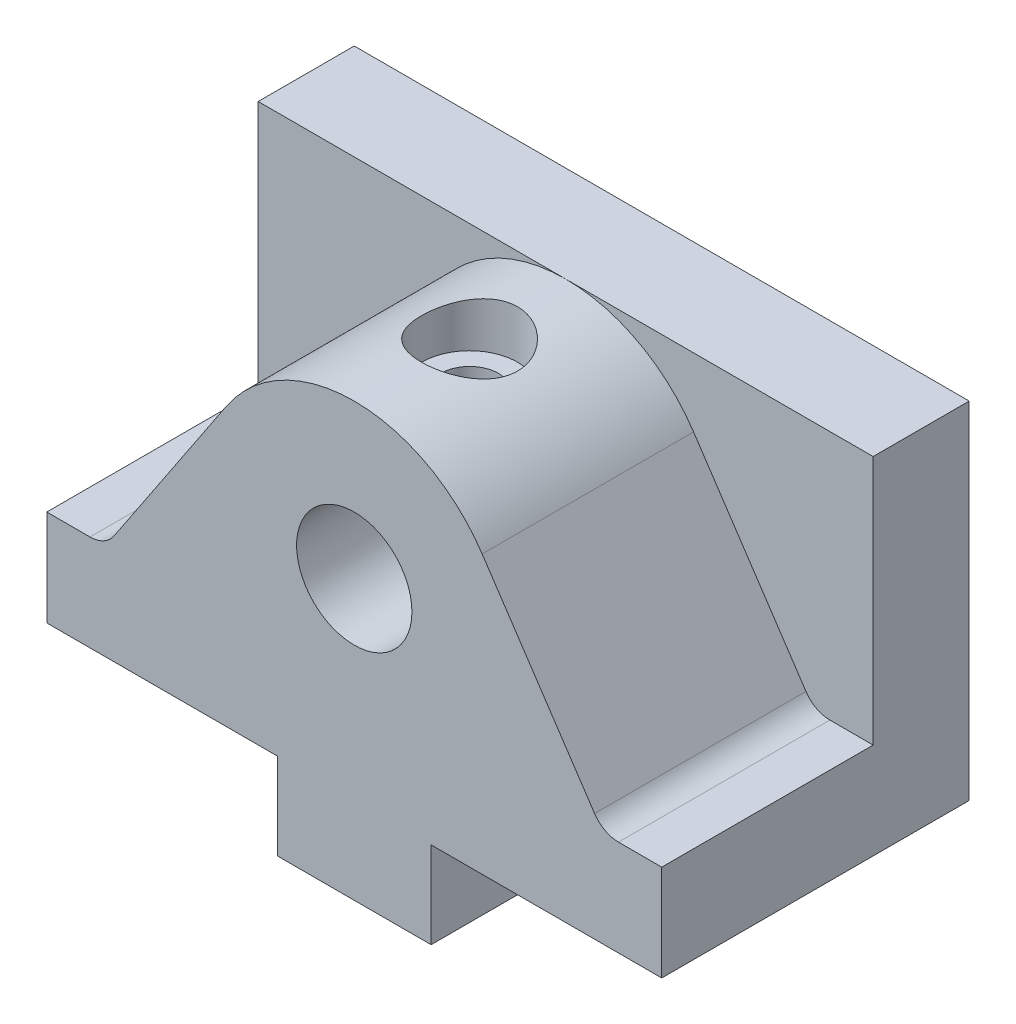
ISO-10303-21;
HEADER;
FILE_DESCRIPTION(('STEP AP214'),'2;1');
FILE_NAME('part.step','',(''),(''),'','','');
FILE_SCHEMA(('AUTOMOTIVE_DESIGN { 1 0 10303 214 1 1 1 1 }'));
ENDSEC;
DATA;
#1=APPLICATION_CONTEXT('core data for automotive mechanical design processes');
#2=APPLICATION_PROTOCOL_DEFINITION('international standard','automotive_design',2000,#1);
#3=PRODUCT_CONTEXT('',#1,'mechanical');
#4=PRODUCT('Part','Part','',(#3));
#5=PRODUCT_RELATED_PRODUCT_CATEGORY('part','',(#4));
#6=PRODUCT_DEFINITION_FORMATION('','',#4);
#7=PRODUCT_DEFINITION_CONTEXT('part definition',#1,'design');
#8=PRODUCT_DEFINITION('design','',#6,#7);
#9=PRODUCT_DEFINITION_SHAPE('','',#8);
#10=(LENGTH_UNIT() NAMED_UNIT(*) SI_UNIT(.MILLI.,.METRE.));
#11=(NAMED_UNIT(*) PLANE_ANGLE_UNIT() SI_UNIT($,.RADIAN.));
#12=(NAMED_UNIT(*) SI_UNIT($,.STERADIAN.) SOLID_ANGLE_UNIT());
#13=UNCERTAINTY_MEASURE_WITH_UNIT(LENGTH_MEASURE(1.E-05),#10,'distance_accuracy_value','');
#14=(GEOMETRIC_REPRESENTATION_CONTEXT(3) GLOBAL_UNCERTAINTY_ASSIGNED_CONTEXT((#13)) GLOBAL_UNIT_ASSIGNED_CONTEXT((#10,
#11,#12)) REPRESENTATION_CONTEXT('',''));
#15=CARTESIAN_POINT('',(0.,0.,0.));
#16=DIRECTION('',(0.,0.,1.));
#17=DIRECTION('',(1.,0.,0.));
#18=AXIS2_PLACEMENT_3D('',#15,#16,#17);
#19=CARTESIAN_POINT('',(-32.,-18.0000000000004,16.));
#20=DIRECTION('',(0.,1.,0.));
#21=DIRECTION('',(0.,0.,0.999999999999989));
#22=AXIS2_PLACEMENT_3D('',#19,#20,#21);
#23=PLANE('',#22);
#24=DIRECTION('',(0.,0.,0.999999999999989));
#25=VECTOR('',#24,1.);
#26=CARTESIAN_POINT('',(8.00000000000001,-18.0000000000004,-15.9999999999997));
#27=LINE('',#26,#25);
#28=CARTESIAN_POINT('',(8.00000000000001,-18.0000000000004,-15.9999999999997));
#29=VERTEX_POINT('',#28);
#30=CARTESIAN_POINT('',(8.00000000000001,-18.,16.));
#31=VERTEX_POINT('',#30);
#32=EDGE_CURVE('E194',#29,#31,#27,.T.);
#33=ORIENTED_EDGE('',*,*,#32,.F.);
#34=DIRECTION('',(1.,0.,0.));
#35=VECTOR('',#34,1.);
#36=CARTESIAN_POINT('',(-32.,-18.0000000000008,-15.9999999999997));
#37=LINE('',#36,#35);
#38=CARTESIAN_POINT('',(32.,-18.0000000000004,-15.9999999999997));
#39=VERTEX_POINT('',#38);
#40=EDGE_CURVE('E332',#29,#39,#37,.T.);
#41=ORIENTED_EDGE('',*,*,#40,.T.);
#42=DIRECTION('',(0.,0.,-0.999999999999989));
#43=VECTOR('',#42,1.);
#44=CARTESIAN_POINT('',(32.,-18.,16.));
#45=LINE('',#44,#43);
#46=CARTESIAN_POINT('',(32.,-18.,16.));
#47=VERTEX_POINT('',#46);
#48=EDGE_CURVE('E357',#47,#39,#45,.T.);
#49=ORIENTED_EDGE('',*,*,#48,.F.);
#50=DIRECTION('',(1.,0.,0.));
#51=VECTOR('',#50,1.);
#52=CARTESIAN_POINT('',(-32.,-18.0000000000004,16.));
#53=LINE('',#52,#51);
#54=EDGE_CURVE('E387',#31,#47,#53,.T.);
#55=ORIENTED_EDGE('',*,*,#54,.F.);
#56=EDGE_LOOP('',(#33,#41,#49,#55));
#57=FACE_BOUND('',#56,.T.);
#58=ADVANCED_FACE('F41',(#57),#23,.F.);
#59=CARTESIAN_POINT('',(-32.,17.9999999999996,15.9999999999998));
#60=DIRECTION('',(1.,0.,0.));
#61=DIRECTION('',(0.,1.,0.));
#62=AXIS2_PLACEMENT_3D('',#59,#60,#61);
#63=PLANE('',#62);
#64=DIRECTION('',(0.,-1.,0.));
#65=VECTOR('',#64,1.);
#66=CARTESIAN_POINT('',(-32.,17.9999999999996,15.9999999999998));
#67=LINE('',#66,#65);
#68=CARTESIAN_POINT('',(-32.,-8.00000000000045,15.9999999999997));
#69=VERTEX_POINT('',#68);
#70=CARTESIAN_POINT('',(-32.,-18.0000000000004,16.));
#71=VERTEX_POINT('',#70);
#72=EDGE_CURVE('E351',#69,#71,#67,.T.);
#73=ORIENTED_EDGE('',*,*,#72,.F.);
#74=DIRECTION('',(0.,0.,-0.999999999999989));
#75=VECTOR('',#74,1.);
#76=CARTESIAN_POINT('',(-32.,-8.00000000000045,15.9999999999997));
#77=LINE('',#76,#75);
#78=CARTESIAN_POINT('',(-32.,-8.00000000000042,-6.));
#79=VERTEX_POINT('',#78);
#80=EDGE_CURVE('E379',#69,#79,#77,.T.);
#81=ORIENTED_EDGE('',*,*,#80,.T.);
#82=DIRECTION('',(0.,1.,0.));
#83=VECTOR('',#82,1.);
#84=CARTESIAN_POINT('',(-32.,17.9999999999996,-5.99999999999988));
#85=LINE('',#84,#83);
#86=CARTESIAN_POINT('',(-32.,17.9999999999996,-5.99999999999988));
#87=VERTEX_POINT('',#86);
#88=EDGE_CURVE('E372',#79,#87,#85,.T.);
#89=ORIENTED_EDGE('',*,*,#88,.T.);
#90=DIRECTION('',(0.,0.,-0.999999999999989));
#91=VECTOR('',#90,1.);
#92=CARTESIAN_POINT('',(-32.,17.9999999999996,15.9999999999998));
#93=LINE('',#92,#91);
#94=CARTESIAN_POINT('',(-32.,17.9999999999992,-15.9999999999997));
#95=VERTEX_POINT('',#94);
#96=EDGE_CURVE('E352',#87,#95,#93,.T.);
#97=ORIENTED_EDGE('',*,*,#96,.T.);
#98=DIRECTION('',(0.,-1.,0.));
#99=VECTOR('',#98,1.);
#100=CARTESIAN_POINT('',(-32.,17.9999999999992,-15.9999999999997));
#101=LINE('',#100,#99);
#102=CARTESIAN_POINT('',(-32.,-18.0000000000008,-15.9999999999997));
#103=VERTEX_POINT('',#102);
#104=EDGE_CURVE('E337',#95,#103,#101,.T.);
#105=ORIENTED_EDGE('',*,*,#104,.T.);
#106=DIRECTION('',(0.,0.,-0.999999999999989));
#107=VECTOR('',#106,1.);
#108=CARTESIAN_POINT('',(-32.,-18.0000000000004,16.));
#109=LINE('',#108,#107);
#110=EDGE_CURVE('E326',#71,#103,#109,.T.);
#111=ORIENTED_EDGE('',*,*,#110,.F.);
#112=EDGE_LOOP('',(#73,#81,#89,#97,#105,#111));
#113=FACE_BOUND('',#112,.T.);
#114=ADVANCED_FACE('F43',(#113),#63,.F.);
#115=CARTESIAN_POINT('',(-7.99999999999999,-18.0000000000004,-15.9999999999997));
#116=VERTEX_POINT('',#115);
#117=EDGE_CURVE('E322',#103,#116,#37,.T.);
#118=ORIENTED_EDGE('',*,*,#117,.T.);
#119=DIRECTION('',(0.,0.,0.999999999999989));
#120=VECTOR('',#119,1.);
#121=CARTESIAN_POINT('',(-7.99999999999999,-18.0000000000004,-15.9999999999997));
#122=LINE('',#121,#120);
#123=CARTESIAN_POINT('',(-7.99999999999999,-18.,16.));
#124=VERTEX_POINT('',#123);
#125=EDGE_CURVE('E205',#116,#124,#122,.T.);
#126=ORIENTED_EDGE('',*,*,#125,.T.);
#127=EDGE_CURVE('E391',#71,#124,#53,.T.);
#128=ORIENTED_EDGE('',*,*,#127,.F.);
#129=ORIENTED_EDGE('',*,*,#110,.T.);
#130=EDGE_LOOP('',(#118,#126,#128,#129));
#131=FACE_BOUND('',#130,.T.);
#132=ADVANCED_FACE('F305',(#131),#23,.F.);
#133=CARTESIAN_POINT('',(32.,18.,15.9999999999998));
#134=DIRECTION('',(-1.,0.,0.));
#135=DIRECTION('',(0.,-1.,0.));
#136=AXIS2_PLACEMENT_3D('',#133,#134,#135);
#137=PLANE('',#136);
#138=DIRECTION('',(0.,-1.,0.));
#139=VECTOR('',#138,1.);
#140=CARTESIAN_POINT('',(32.,18.,-5.99999999999988));
#141=LINE('',#140,#139);
#142=CARTESIAN_POINT('',(32.,18.,-5.99999999999988));
#143=VERTEX_POINT('',#142);
#144=CARTESIAN_POINT('',(32.,-8.00750575677747,-6.));
#145=VERTEX_POINT('',#144);
#146=EDGE_CURVE('E380',#143,#145,#141,.T.);
#147=ORIENTED_EDGE('',*,*,#146,.T.);
#148=DIRECTION('',(0.,0.,0.999999999999989));
#149=VECTOR('',#148,1.);
#150=CARTESIAN_POINT('',(32.,-8.00750575677747,-6.));
#151=LINE('',#150,#149);
#152=CARTESIAN_POINT('',(32.,-8.00750575677747,15.9999999999997));
#153=VERTEX_POINT('',#152);
#154=EDGE_CURVE('E403',#145,#153,#151,.T.);
#155=ORIENTED_EDGE('',*,*,#154,.T.);
#156=DIRECTION('',(0.,1.,0.));
#157=VECTOR('',#156,1.);
#158=CARTESIAN_POINT('',(32.,18.,15.9999999999998));
#159=LINE('',#158,#157);
#160=EDGE_CURVE('E355',#47,#153,#159,.T.);
#161=ORIENTED_EDGE('',*,*,#160,.F.);
#162=ORIENTED_EDGE('',*,*,#48,.T.);
#163=DIRECTION('',(0.,1.,0.));
#164=VECTOR('',#163,1.);
#165=CARTESIAN_POINT('',(32.,17.9999999999996,-15.9999999999997));
#166=LINE('',#165,#164);
#167=CARTESIAN_POINT('',(32.,17.9999999999996,-15.9999999999997));
#168=VERTEX_POINT('',#167);
#169=EDGE_CURVE('E331',#39,#168,#166,.T.);
#170=ORIENTED_EDGE('',*,*,#169,.T.);
#171=DIRECTION('',(0.,0.,-0.999999999999989));
#172=VECTOR('',#171,1.);
#173=CARTESIAN_POINT('',(32.,18.,15.9999999999998));
#174=LINE('',#173,#172);
#175=EDGE_CURVE('E354',#143,#168,#174,.T.);
#176=ORIENTED_EDGE('',*,*,#175,.F.);
#177=EDGE_LOOP('',(#147,#155,#161,#162,#170,#176));
#178=FACE_BOUND('',#177,.T.);
#179=ADVANCED_FACE('F313',(#178),#137,.F.);
#180=CARTESIAN_POINT('',(-32.,17.9999999999996,15.9999999999998));
#181=DIRECTION('',(0.,-1.,0.));
#182=DIRECTION('',(1.,0.,0.));
#183=AXIS2_PLACEMENT_3D('',#180,#181,#182);
#184=PLANE('',#183);
#185=ORIENTED_EDGE('',*,*,#96,.F.);
#186=DIRECTION('',(1.,0.,0.));
#187=VECTOR('',#186,1.);
#188=CARTESIAN_POINT('',(-32.,17.9999999999996,-5.99999999999988));
#189=LINE('',#188,#187);
#190=CARTESIAN_POINT('',(0.,18.,-5.99999999999988));
#191=VERTEX_POINT('',#190);
#192=EDGE_CURVE('E55',#87,#191,#189,.T.);
#193=ORIENTED_EDGE('',*,*,#192,.T.);
#194=EDGE_CURVE('E341',#191,#143,#189,.T.);
#195=ORIENTED_EDGE('',*,*,#194,.T.);
#196=ORIENTED_EDGE('',*,*,#175,.T.);
#197=DIRECTION('',(-1.,0.,0.));
#198=VECTOR('',#197,1.);
#199=CARTESIAN_POINT('',(-32.,17.9999999999992,-15.9999999999997));
#200=LINE('',#199,#198);
#201=EDGE_CURVE('E335',#168,#95,#200,.T.);
#202=ORIENTED_EDGE('',*,*,#201,.T.);
#203=EDGE_LOOP('',(#185,#193,#195,#196,#202));
#204=FACE_BOUND('',#203,.T.);
#205=ADVANCED_FACE('F318',(#204),#184,.F.);
#206=CARTESIAN_POINT('',(0.,0.,16.));
#207=DIRECTION('',(0.,0.,0.999999999999989));
#208=DIRECTION('',(1.,0.,0.));
#209=AXIS2_PLACEMENT_3D('',#206,#207,#208);
#210=PLANE('',#209);
#211=CARTESIAN_POINT('',(0.,2.,16.));
#212=DIRECTION('',(0.,0.,0.999999999999989));
#213=DIRECTION('',(1.,0.,0.));
#214=AXIS2_PLACEMENT_3D('',#211,#212,#213);
#215=CIRCLE('',#214,6.);
#216=CARTESIAN_POINT('',(6.,2.,16.));
#217=VERTEX_POINT('',#216);
#218=EDGE_CURVE('E202',#217,#217,#215,.T.);
#219=ORIENTED_EDGE('',*,*,#218,.F.);
#220=EDGE_LOOP('',(#219));
#221=FACE_BOUND('',#220,.T.);
#222=DIRECTION('',(1.,0.,0.));
#223=VECTOR('',#222,1.);
#224=CARTESIAN_POINT('',(0.,-8.00000000000001,15.9999999999997));
#225=LINE('',#224,#223);
#226=CARTESIAN_POINT('',(-27.4999965616356,-8.00000000000045,15.9999999999997));
#227=VERTEX_POINT('',#226);
#228=EDGE_CURVE('E362',#69,#227,#225,.T.);
#229=ORIENTED_EDGE('',*,*,#228,.F.);
#230=ORIENTED_EDGE('',*,*,#72,.T.);
#231=ORIENTED_EDGE('',*,*,#127,.T.);
#232=DIRECTION('',(0.,-1.,0.));
#233=VECTOR('',#232,1.);
#234=CARTESIAN_POINT('',(-7.99999999999999,-18.,16.));
#235=LINE('',#234,#233);
#236=CARTESIAN_POINT('',(-7.99999999999976,-27.0000000000002,16.));
#237=VERTEX_POINT('',#236);
#238=EDGE_CURVE('E62',#124,#237,#235,.T.);
#239=ORIENTED_EDGE('',*,*,#238,.T.);
#240=DIRECTION('',(1.,0.,0.));
#241=VECTOR('',#240,1.);
#242=CARTESIAN_POINT('',(-7.99999999999976,-27.0000000000002,16.));
#243=LINE('',#242,#241);
#244=CARTESIAN_POINT('',(8.00000000000024,-27.0000000000002,16.));
#245=VERTEX_POINT('',#244);
#246=EDGE_CURVE('E196',#237,#245,#243,.T.);
#247=ORIENTED_EDGE('',*,*,#246,.T.);
#248=DIRECTION('',(0.,1.,0.));
#249=VECTOR('',#248,1.);
#250=CARTESIAN_POINT('',(8.00000000000001,-18.,16.));
#251=LINE('',#250,#249);
#252=EDGE_CURVE('E190',#245,#31,#251,.T.);
#253=ORIENTED_EDGE('',*,*,#252,.T.);
#254=ORIENTED_EDGE('',*,*,#54,.T.);
#255=ORIENTED_EDGE('',*,*,#160,.T.);
#256=DIRECTION('',(0.999999243771718,-0.00122981949535773,0.));
#257=VECTOR('',#256,1.);
#258=CARTESIAN_POINT('',(27.5000034030273,-8.00197156904836,15.9999999999997));
#259=LINE('',#258,#257);
#260=CARTESIAN_POINT('',(27.5000034030273,-8.00197156904836,15.9999999999997));
#261=VERTEX_POINT('',#260);
#262=EDGE_CURVE('E441',#261,#153,#259,.T.);
#263=ORIENTED_EDGE('',*,*,#262,.F.);
#264=CARTESIAN_POINT('',(27.5036928615133,-5.00197383773321,16.));
#265=DIRECTION('',(0.,0.,0.999999999999989));
#266=DIRECTION('',(-1.,0.,0.));
#267=AXIS2_PLACEMENT_3D('',#264,#265,#266);
#268=CIRCLE('',#267,3.);
#269=CARTESIAN_POINT('',(25.0075782470475,-6.66612882794598,16.));
#270=VERTEX_POINT('',#269);
#271=EDGE_CURVE('E439',#270,#261,#268,.T.);
#272=ORIENTED_EDGE('',*,*,#271,.F.);
#273=DIRECTION('',(0.554718330070926,-0.832038204821944,0.));
#274=VECTOR('',#273,1.);
#275=CARTESIAN_POINT('',(13.3126112771511,10.8754932811348,16.));
#276=LINE('',#275,#274);
#277=CARTESIAN_POINT('',(13.3126112771511,10.8754932811348,16.));
#278=VERTEX_POINT('',#277);
#279=EDGE_CURVE('E437',#278,#270,#276,.T.);
#280=ORIENTED_EDGE('',*,*,#279,.F.);
#281=CARTESIAN_POINT('',(0.,2.,16.));
#282=DIRECTION('',(0.,0.,0.999999999999989));
#283=DIRECTION('',(1.,0.,0.));
#284=AXIS2_PLACEMENT_3D('',#281,#282,#283);
#285=CIRCLE('',#284,16.);
#286=CARTESIAN_POINT('',(-13.3134451757018,10.8742423650458,16.));
#287=VERTEX_POINT('',#286);
#288=EDGE_CURVE('E361',#287,#278,#285,.F.);
#289=ORIENTED_EDGE('',*,*,#288,.F.);
#290=DIRECTION('',(0.554640147815392,0.832090323481364,0.));
#291=VECTOR('',#290,1.);
#292=CARTESIAN_POINT('',(-25.0037255911915,-6.66392044344663,16.));
#293=LINE('',#292,#291);
#294=CARTESIAN_POINT('',(-25.0037255911915,-6.66392044344663,16.));
#295=VERTEX_POINT('',#294);
#296=EDGE_CURVE('E434',#295,#287,#293,.T.);
#297=ORIENTED_EDGE('',*,*,#296,.F.);
#298=CARTESIAN_POINT('',(-27.4999965616356,-5.00000000000045,16.));
#299=DIRECTION('',(0.,0.,0.999999999999989));
#300=DIRECTION('',(-1.,0.,0.));
#301=AXIS2_PLACEMENT_3D('',#298,#299,#300);
#302=CIRCLE('',#301,3.);
#303=EDGE_CURVE('E70',#227,#295,#302,.T.);
#304=ORIENTED_EDGE('',*,*,#303,.F.);
#305=EDGE_LOOP('',(#229,#230,#231,#239,#247,#253,#254,#255,#263,#272,#280,#289,#297,#304));
#306=FACE_BOUND('',#305,.T.);
#307=ADVANCED_FACE('F396',(#221,#306),#210,.T.);
#308=CARTESIAN_POINT('',(0.,-4.16333634234434E-13,-15.9999999999997));
#309=DIRECTION('',(0.,0.,0.999999999999989));
#310=DIRECTION('',(1.,0.,0.));
#311=AXIS2_PLACEMENT_3D('',#308,#309,#310);
#312=PLANE('',#311);
#313=ORIENTED_EDGE('',*,*,#104,.F.);
#314=ORIENTED_EDGE('',*,*,#201,.F.);
#315=ORIENTED_EDGE('',*,*,#169,.F.);
#316=ORIENTED_EDGE('',*,*,#40,.F.);
#317=DIRECTION('',(0.,1.,0.));
#318=VECTOR('',#317,1.);
#319=CARTESIAN_POINT('',(8.00000000000001,-18.0000000000004,-15.9999999999997));
#320=LINE('',#319,#318);
#321=CARTESIAN_POINT('',(8.00000000000024,-27.0000000000004,-15.9999999999997));
#322=VERTEX_POINT('',#321);
#323=EDGE_CURVE('E199',#322,#29,#320,.T.);
#324=ORIENTED_EDGE('',*,*,#323,.F.);
#325=DIRECTION('',(1.,0.,0.));
#326=VECTOR('',#325,1.);
#327=CARTESIAN_POINT('',(-7.99999999999976,-27.0000000000004,-15.9999999999997));
#328=LINE('',#327,#326);
#329=CARTESIAN_POINT('',(-7.99999999999976,-27.0000000000004,-15.9999999999997));
#330=VERTEX_POINT('',#329);
#331=EDGE_CURVE('E191',#330,#322,#328,.T.);
#332=ORIENTED_EDGE('',*,*,#331,.F.);
#333=DIRECTION('',(0.,-1.,0.));
#334=VECTOR('',#333,1.);
#335=CARTESIAN_POINT('',(-7.99999999999999,-18.0000000000004,-15.9999999999997));
#336=LINE('',#335,#334);
#337=EDGE_CURVE('E195',#116,#330,#336,.T.);
#338=ORIENTED_EDGE('',*,*,#337,.F.);
#339=ORIENTED_EDGE('',*,*,#117,.F.);
#340=EDGE_LOOP('',(#313,#314,#315,#316,#324,#332,#338,#339));
#341=FACE_BOUND('',#340,.T.);
#342=ADVANCED_FACE('F281',(#341),#312,.F.);
#343=CARTESIAN_POINT('',(-27.4999965616356,-5.00000000000042,-6.));
#344=DIRECTION('',(0.,0.,-0.999999999999989));
#345=DIRECTION('',(-1.,0.,0.));
#346=AXIS2_PLACEMENT_3D('',#343,#344,#345);
#347=PLANE('',#346);
#348=DIRECTION('',(1.,0.,0.));
#349=VECTOR('',#348,1.);
#350=CARTESIAN_POINT('',(-32.,-8.00000000000042,-6.));
#351=LINE('',#350,#349);
#352=CARTESIAN_POINT('',(-27.4999965616356,-8.00000000000042,-6.));
#353=VERTEX_POINT('',#352);
#354=EDGE_CURVE('E422',#79,#353,#351,.T.);
#355=ORIENTED_EDGE('',*,*,#354,.T.);
#356=CARTESIAN_POINT('',(-27.4999965616356,-5.00000000000042,-6.));
#357=DIRECTION('',(0.,0.,0.999999999999989));
#358=DIRECTION('',(-1.,0.,0.));
#359=AXIS2_PLACEMENT_3D('',#356,#357,#358);
#360=CIRCLE('',#359,3.);
#361=CARTESIAN_POINT('',(-25.0037255911915,-6.6639204434466,-6.));
#362=VERTEX_POINT('',#361);
#363=EDGE_CURVE('E442',#353,#362,#360,.T.);
#364=ORIENTED_EDGE('',*,*,#363,.T.);
#365=DIRECTION('',(0.554640147815392,0.832090323481364,0.));
#366=VECTOR('',#365,1.);
#367=CARTESIAN_POINT('',(-25.0037255911915,-6.6639204434466,-6.));
#368=LINE('',#367,#366);
#369=CARTESIAN_POINT('',(-13.3134451757018,10.8742423650459,-6.));
#370=VERTEX_POINT('',#369);
#371=EDGE_CURVE('E443',#362,#370,#368,.T.);
#372=ORIENTED_EDGE('',*,*,#371,.T.);
#373=CARTESIAN_POINT('',(0.,2.,-6.));
#374=DIRECTION('',(0.,0.,-0.999999999999989));
#375=DIRECTION('',(1.,0.,0.));
#376=AXIS2_PLACEMENT_3D('',#373,#374,#375);
#377=CIRCLE('',#376,16.);
#378=EDGE_CURVE('E376',#370,#191,#377,.T.);
#379=ORIENTED_EDGE('',*,*,#378,.T.);
#380=ORIENTED_EDGE('',*,*,#192,.F.);
#381=ORIENTED_EDGE('',*,*,#88,.F.);
#382=EDGE_LOOP('',(#355,#364,#372,#379,#380,#381));
#383=FACE_BOUND('',#382,.T.);
#384=ADVANCED_FACE('F277',(#383),#347,.F.);
#385=ORIENTED_EDGE('',*,*,#194,.F.);
#386=CARTESIAN_POINT('',(13.3126112771511,10.8754932811348,-6.));
#387=VERTEX_POINT('',#386);
#388=EDGE_CURVE('E446',#191,#387,#377,.T.);
#389=ORIENTED_EDGE('',*,*,#388,.T.);
#390=DIRECTION('',(0.554718330070926,-0.832038204821944,0.));
#391=VECTOR('',#390,1.);
#392=CARTESIAN_POINT('',(13.3126112771511,10.8754932811348,-6.));
#393=LINE('',#392,#391);
#394=CARTESIAN_POINT('',(25.0075782470475,-6.66612882794598,-6.));
#395=VERTEX_POINT('',#394);
#396=EDGE_CURVE('E451',#387,#395,#393,.T.);
#397=ORIENTED_EDGE('',*,*,#396,.T.);
#398=CARTESIAN_POINT('',(27.5036928615133,-5.00197383773321,-6.));
#399=DIRECTION('',(0.,0.,0.999999999999989));
#400=DIRECTION('',(-1.,0.,0.));
#401=AXIS2_PLACEMENT_3D('',#398,#399,#400);
#402=CIRCLE('',#401,3.);
#403=CARTESIAN_POINT('',(27.5000034030273,-8.00197156904836,-6.));
#404=VERTEX_POINT('',#403);
#405=EDGE_CURVE('E429',#395,#404,#402,.T.);
#406=ORIENTED_EDGE('',*,*,#405,.T.);
#407=DIRECTION('',(0.999999243771718,-0.00122981949535773,0.));
#408=VECTOR('',#407,1.);
#409=CARTESIAN_POINT('',(27.5000034030273,-8.00197156904836,-6.));
#410=LINE('',#409,#408);
#411=EDGE_CURVE('E426',#404,#145,#410,.T.);
#412=ORIENTED_EDGE('',*,*,#411,.T.);
#413=ORIENTED_EDGE('',*,*,#146,.F.);
#414=EDGE_LOOP('',(#385,#389,#397,#406,#412,#413));
#415=FACE_BOUND('',#414,.T.);
#416=ADVANCED_FACE('F280',(#415),#347,.F.);
#417=CARTESIAN_POINT('',(-32.,-8.00000000000042,-6.));
#418=DIRECTION('',(0.,-1.,0.));
#419=DIRECTION('',(0.,0.,-0.999999999999989));
#420=AXIS2_PLACEMENT_3D('',#417,#418,#419);
#421=PLANE('',#420);
#422=ORIENTED_EDGE('',*,*,#228,.T.);
#423=DIRECTION('',(0.,0.,0.999999999999989));
#424=VECTOR('',#423,1.);
#425=CARTESIAN_POINT('',(-27.4999965616356,-8.00000000000042,-6.));
#426=LINE('',#425,#424);
#427=EDGE_CURVE('E406',#353,#227,#426,.T.);
#428=ORIENTED_EDGE('',*,*,#427,.F.);
#429=ORIENTED_EDGE('',*,*,#354,.F.);
#430=ORIENTED_EDGE('',*,*,#80,.F.);
#431=EDGE_LOOP('',(#422,#428,#429,#430));
#432=FACE_BOUND('',#431,.T.);
#433=ADVANCED_FACE('F283',(#432),#421,.F.);
#434=CARTESIAN_POINT('',(0.,2.,-6.));
#435=DIRECTION('',(0.,0.,0.999999999999989));
#436=DIRECTION('',(1.,0.,0.));
#437=AXIS2_PLACEMENT_3D('',#434,#435,#436);
#438=CYLINDRICAL_SURFACE('',#437,16.);
#439=CARTESIAN_POINT('',(0.,18.,8.99999999999978));
#440=CARTESIAN_POINT('',(-0.273756740698203,17.9999986351195,8.99999821364948));
#441=CARTESIAN_POINT('',(-0.547532210011458,17.9929077993933,8.97744309222222));
#442=CARTESIAN_POINT('',(-1.08707683835385,17.9653157635526,8.88805503384302));
#443=CARTESIAN_POINT('',(-1.35284417090371,17.9448115279957,8.82121207454223));
#444=CARTESIAN_POINT('',(-1.86851417460314,17.892632627915,8.64572251521696));
#445=CARTESIAN_POINT('',(-2.11844070794293,17.860975259956,8.5371406213886));
#446=CARTESIAN_POINT('',(-2.5965392093863,17.7897587664487,8.28153072928613));
#447=CARTESIAN_POINT('',(-2.82470774178095,17.7501983960149,8.13449667287551));
#448=CARTESIAN_POINT('',(-3.25986133980766,17.6660085495921,7.80137603193234));
#449=CARTESIAN_POINT('',(-3.46608011262123,17.621268637007,7.6143164597632));
#450=CARTESIAN_POINT('',(-3.84478952815349,17.5324018550409,7.20852643033821));
#451=CARTESIAN_POINT('',(-4.01727389161517,17.4882751012093,6.98979008999342));
#452=CARTESIAN_POINT('',(-4.32777345930636,17.4044457876485,6.52022174479267));
#453=CARTESIAN_POINT('',(-4.46483136593109,17.3648795310221,6.2687300899923));
#454=CARTESIAN_POINT('',(-4.69438964299238,17.2963120709366,5.74483074017738));
#455=CARTESIAN_POINT('',(-4.78690175085852,17.2673080849026,5.47242857685659));
#456=CARTESIAN_POINT('',(-4.92193839721855,17.224304279618,4.92308769016631));
#457=CARTESIAN_POINT('',(-4.96588440031618,17.2098789171452,4.64653262543181));
#458=CARTESIAN_POINT('',(-5.00698220147793,17.1964022056731,4.08962752436521));
#459=CARTESIAN_POINT('',(-5.00414643984171,17.1973467694717,3.80927851673902));
#460=CARTESIAN_POINT('',(-4.95287298929816,17.2141275626545,3.26450215888892));
#461=CARTESIAN_POINT('',(-4.90624231472934,17.229373668447,2.99988349644806));
#462=CARTESIAN_POINT('',(-4.7716325341796,17.272081024701,2.48243137375098));
#463=CARTESIAN_POINT('',(-4.68364903377186,17.2995435733467,2.22959916914171));
#464=CARTESIAN_POINT('',(-4.46755498726522,17.3640417609541,1.73859222230163));
#465=CARTESIAN_POINT('',(-4.33887702648709,17.4012113865356,1.50068555724072));
#466=CARTESIAN_POINT('',(-4.04544082951014,17.4808742631002,1.04924892847494));
#467=CARTESIAN_POINT('',(-3.88067322086204,17.523368895754,0.835725318982906));
#468=CARTESIAN_POINT('',(-3.51086781672958,17.6112611120491,0.42890022633462));
#469=CARTESIAN_POINT('',(-3.3043382823716,17.6567027842357,0.236961768881972));
#470=CARTESIAN_POINT('',(-2.86145763238188,17.7436628303753,-0.109887574319321));
#471=CARTESIAN_POINT('',(-2.62510430939601,17.7851809135328,-0.264795716876882));
#472=CARTESIAN_POINT('',(-2.12665844186189,17.8600517956098,-0.53411075440481));
#473=CARTESIAN_POINT('',(-1.86437962767716,17.8933384259289,-0.648192541855809));
#474=CARTESIAN_POINT('',(-1.32307191113059,17.9475182331416,-0.830212003406286));
#475=CARTESIAN_POINT('',(-1.04404812289844,17.968415173006,-0.898163688953468));
#476=CARTESIAN_POINT('',(-0.488740629161378,17.9948555758007,-0.983672170315793));
#477=CARTESIAN_POINT('',(-0.212767395155369,18.0009609158175,-1.00307417437408));
#478=CARTESIAN_POINT('',(0.338521222930339,17.9987919892393,-0.996135093450667));
#479=CARTESIAN_POINT('',(0.613836697226024,17.9905198232454,-0.969800690709442));
#480=CARTESIAN_POINT('',(1.1488773319034,17.9608945507905,-0.873617629574333));
#481=CARTESIAN_POINT('',(1.40881991368378,17.9398717244275,-0.804866929550025));
#482=CARTESIAN_POINT('',(1.91340771544553,17.8872048551716,-0.627142590533112));
#483=CARTESIAN_POINT('',(2.15805104179622,17.8555595005738,-0.518163983899842));
#484=CARTESIAN_POINT('',(2.63172962668875,17.783941710377,-0.260107133805127));
#485=CARTESIAN_POINT('',(2.86023895915121,17.7437850727067,-0.110116050012705));
#486=CARTESIAN_POINT('',(3.28946340384108,17.6597364001372,0.224612840469742));
#487=CARTESIAN_POINT('',(3.4901709521758,17.6158433539155,0.409360070978669));
#488=CARTESIAN_POINT('',(3.86634985167605,17.5270797953257,0.817035560208513));
#489=CARTESIAN_POINT('',(4.04050609358126,17.4822394682577,1.04118665495696));
#490=CARTESIAN_POINT('',(4.34885000980608,17.3984778838242,1.51650646550711));
#491=CARTESIAN_POINT('',(4.48303831893719,17.3595565324524,1.76767475210795));
#492=CARTESIAN_POINT('',(4.70680333922168,17.2924712932348,2.28938069148192));
#493=CARTESIAN_POINT('',(4.79655278224049,17.264265854275,2.55983859774289));
#494=CARTESIAN_POINT('',(4.9289157727236,17.2220468337724,3.11308997299448));
#495=CARTESIAN_POINT('',(4.97154725655977,17.2080278520491,3.39587870537413));
#496=CARTESIAN_POINT('',(5.00717624632502,17.1963317085551,3.95201635032171));
#497=CARTESIAN_POINT('',(5.00233118486542,17.1979441840057,4.22521381538967));
#498=CARTESIAN_POINT('',(4.94835272515335,17.2156036150362,4.76669833976775));
#499=CARTESIAN_POINT('',(4.89922139290049,17.2316498972642,5.03498562754694));
#500=CARTESIAN_POINT('',(4.7595091965447,17.2758725673356,5.55517615836757));
#501=CARTESIAN_POINT('',(4.66954569624033,17.3038679276103,5.80726176437345));
#502=CARTESIAN_POINT('',(4.45120909339998,17.3687881701826,6.29296165413602));
#503=CARTESIAN_POINT('',(4.32282817776947,17.4057148685869,6.52657216831362));
#504=CARTESIAN_POINT('',(4.02542700053976,17.4861394813401,6.97858388175925));
#505=CARTESIAN_POINT('',(3.85501334096536,17.5298379569183,7.19603251800096));
#506=CARTESIAN_POINT('',(3.48083598561924,17.6179599528484,7.59994531244788));
#507=CARTESIAN_POINT('',(3.27706336937754,17.6623836642662,7.786401155964));
#508=CARTESIAN_POINT('',(2.83394665129338,17.748690878099,8.12913015345153));
#509=CARTESIAN_POINT('',(2.59365829794962,17.7904440692269,8.28421894579978));
#510=CARTESIAN_POINT('',(2.08911655205469,17.8650707718751,8.55159566055776));
#511=CARTESIAN_POINT('',(1.82487263118181,17.8979477726329,8.6639004085671));
#512=CARTESIAN_POINT('',(1.3029905414959,17.9488260293388,8.83436547043366));
#513=CARTESIAN_POINT('',(1.04668134845021,17.9678496322456,8.89629946922136));
#514=CARTESIAN_POINT('',(0.526919581761033,17.9934360136194,8.97911343987086));
#515=CARTESIAN_POINT('',(0.263468464558714,18.0000013135858,9.00000171921579));
#516=CARTESIAN_POINT('',(0.,18.,8.99999999999978));
#517=B_SPLINE_CURVE_WITH_KNOTS('',3,(#439,#440,#441,#442,#443,#444,#445,#446,#447,#448,#449,
#450,#451,#452,#453,#454,#455,#456,#457,#458,#459,#460,#461,#462,#463,#464,#465,#466,#467,#468,
#469,#470,#471,#472,#473,#474,#475,#476,#477,#478,#479,#480,#481,#482,#483,#484,#485,#486,#487,
#488,#489,#490,#491,#492,#493,#494,#495,#496,#497,#498,#499,#500,#501,#502,#503,#504,#505,#506,
#507,#508,#509,#510,#511,#512,#513,#514,#515,#516),.UNSPECIFIED.,.T.,.F.,(4,2,2,2,2,2,2,2,2,2,2,
2,2,2,2,2,2,2,2,2,2,2,2,2,2,2,2,2,2,2,2,2,2,2,2,2,2,2,4),(0.,0.82030179773006,1.6407892933963,
2.46000991680979,3.27935968623363,4.12151288780633,4.96382269725097,5.82695084991444,
6.68985145121455,7.52676600672187,8.363458011839,9.16707669695186,9.97078079925592,
10.7862257089152,11.6018826405077,12.4546698912773,13.3075202966255,14.1670184276841,
15.0262553798755,15.8523027420228,16.6782294260679,17.4836250690082,18.2891202014734,
19.1142529896271,19.9396098284638,20.7976711486189,21.6557188394418,22.5104046302275,
23.3647649559869,24.1804881394264,24.9961732705186,25.7999165363421,26.6038233736822,
27.4391805607296,28.2747614954087,29.1376267255316,30.0001522671286,30.7897854665367,
31.579258830997),.UNSPECIFIED.);
#518=CARTESIAN_POINT('',(0.,18.,8.99999999999978));
#519=VERTEX_POINT('',#518);
#520=EDGE_CURVE('E11',#519,#519,#517,.T.);
#521=ORIENTED_EDGE('',*,*,#520,.T.);
#522=EDGE_LOOP('',(#521));
#523=FACE_BOUND('',#522,.T.);
#524=ORIENTED_EDGE('',*,*,#288,.T.);
#525=DIRECTION('',(0.,0.,0.999999999999989));
#526=VECTOR('',#525,1.);
#527=CARTESIAN_POINT('',(13.3126112771511,10.8754932811348,-6.));
#528=LINE('',#527,#526);
#529=EDGE_CURVE('E415',#387,#278,#528,.T.);
#530=ORIENTED_EDGE('',*,*,#529,.F.);
#531=ORIENTED_EDGE('',*,*,#388,.F.);
#532=ORIENTED_EDGE('',*,*,#378,.F.);
#533=DIRECTION('',(0.,0.,0.999999999999989));
#534=VECTOR('',#533,1.);
#535=CARTESIAN_POINT('',(-13.3134451757018,10.8742423650459,-6.));
#536=LINE('',#535,#534);
#537=EDGE_CURVE('E418',#370,#287,#536,.T.);
#538=ORIENTED_EDGE('',*,*,#537,.T.);
#539=EDGE_LOOP('',(#524,#530,#531,#532,#538));
#540=FACE_BOUND('',#539,.T.);
#541=ADVANCED_FACE('F231',(#523,#540),#438,.T.);
#542=CARTESIAN_POINT('',(-27.4999965616356,-5.00000000000042,-6.));
#543=DIRECTION('',(0.,0.,0.999999999999989));
#544=DIRECTION('',(1.,0.,0.));
#545=AXIS2_PLACEMENT_3D('',#542,#543,#544);
#546=CYLINDRICAL_SURFACE('',#545,3.);
#547=ORIENTED_EDGE('',*,*,#303,.T.);
#548=DIRECTION('',(0.,0.,0.999999999999989));
#549=VECTOR('',#548,1.);
#550=CARTESIAN_POINT('',(-25.0037255911915,-6.6639204434466,-6.));
#551=LINE('',#550,#549);
#552=EDGE_CURVE('E421',#362,#295,#551,.T.);
#553=ORIENTED_EDGE('',*,*,#552,.F.);
#554=ORIENTED_EDGE('',*,*,#363,.F.);
#555=ORIENTED_EDGE('',*,*,#427,.T.);
#556=EDGE_LOOP('',(#547,#553,#554,#555));
#557=FACE_BOUND('',#556,.T.);
#558=ADVANCED_FACE('F291',(#557),#546,.F.);
#559=CARTESIAN_POINT('',(27.5000034030273,-8.00197156904836,-6.));
#560=DIRECTION('',(-0.00122981949535773,-0.999999243771719,0.));
#561=DIRECTION('',(0.999999243771719,-0.00122981949535773,0.));
#562=AXIS2_PLACEMENT_3D('',#559,#560,#561);
#563=PLANE('',#562);
#564=ORIENTED_EDGE('',*,*,#262,.T.);
#565=ORIENTED_EDGE('',*,*,#154,.F.);
#566=ORIENTED_EDGE('',*,*,#411,.F.);
#567=DIRECTION('',(0.,0.,0.999999999999989));
#568=VECTOR('',#567,1.);
#569=CARTESIAN_POINT('',(27.5000034030273,-8.00197156904836,-6.));
#570=LINE('',#569,#568);
#571=EDGE_CURVE('E407',#404,#261,#570,.T.);
#572=ORIENTED_EDGE('',*,*,#571,.T.);
#573=EDGE_LOOP('',(#564,#565,#566,#572));
#574=FACE_BOUND('',#573,.T.);
#575=ADVANCED_FACE('F287',(#574),#563,.F.);
#576=CARTESIAN_POINT('',(27.5036928615133,-5.00197383773321,-6.));
#577=DIRECTION('',(0.,0.,0.999999999999989));
#578=DIRECTION('',(1.,0.,0.));
#579=AXIS2_PLACEMENT_3D('',#576,#577,#578);
#580=CYLINDRICAL_SURFACE('',#579,3.);
#581=ORIENTED_EDGE('',*,*,#271,.T.);
#582=ORIENTED_EDGE('',*,*,#571,.F.);
#583=ORIENTED_EDGE('',*,*,#405,.F.);
#584=DIRECTION('',(0.,0.,0.999999999999989));
#585=VECTOR('',#584,1.);
#586=CARTESIAN_POINT('',(25.0075782470475,-6.66612882794598,-6.));
#587=LINE('',#586,#585);
#588=EDGE_CURVE('E410',#395,#270,#587,.T.);
#589=ORIENTED_EDGE('',*,*,#588,.T.);
#590=EDGE_LOOP('',(#581,#582,#583,#589));
#591=FACE_BOUND('',#590,.T.);
#592=ADVANCED_FACE('F290',(#591),#580,.F.);
#593=CARTESIAN_POINT('',(13.3126112771511,10.8754932811348,-6.));
#594=DIRECTION('',(-0.832038204821944,-0.554718330070926,0.));
#595=DIRECTION('',(0.554718330070926,-0.832038204821944,0.));
#596=AXIS2_PLACEMENT_3D('',#593,#594,#595);
#597=PLANE('',#596);
#598=ORIENTED_EDGE('',*,*,#279,.T.);
#599=ORIENTED_EDGE('',*,*,#588,.F.);
#600=ORIENTED_EDGE('',*,*,#396,.F.);
#601=ORIENTED_EDGE('',*,*,#529,.T.);
#602=EDGE_LOOP('',(#598,#599,#600,#601));
#603=FACE_BOUND('',#602,.T.);
#604=ADVANCED_FACE('F294',(#603),#597,.F.);
#605=CARTESIAN_POINT('',(-25.0037255911915,-6.6639204434466,-6.));
#606=DIRECTION('',(0.832090323481364,-0.554640147815392,0.));
#607=DIRECTION('',(0.554640147815392,0.832090323481364,0.));
#608=AXIS2_PLACEMENT_3D('',#605,#606,#607);
#609=PLANE('',#608);
#610=ORIENTED_EDGE('',*,*,#296,.T.);
#611=ORIENTED_EDGE('',*,*,#537,.F.);
#612=ORIENTED_EDGE('',*,*,#371,.F.);
#613=ORIENTED_EDGE('',*,*,#552,.T.);
#614=EDGE_LOOP('',(#610,#611,#612,#613));
#615=FACE_BOUND('',#614,.T.);
#616=ADVANCED_FACE('F275',(#615),#609,.F.);
#617=CARTESIAN_POINT('',(0.,2.,-7.99999999999967));
#618=DIRECTION('',(0.,0.,0.999999999999989));
#619=DIRECTION('',(1.,0.,0.));
#620=AXIS2_PLACEMENT_3D('',#617,#618,#619);
#621=CYLINDRICAL_SURFACE('',#620,6.);
#622=CARTESIAN_POINT('',(0.,8.00000000000001,7.));
#623=CARTESIAN_POINT('',(0.0788941476270903,7.99999934964154,6.99999916125948));
#624=CARTESIAN_POINT('',(0.15779662040795,7.99843869002385,6.99688205452447));
#625=CARTESIAN_POINT('',(0.315001991255923,7.99224358793258,6.98446072826003));
#626=CARTESIAN_POINT('',(0.393304603620536,7.98760776295702,6.97515372593456));
#627=CARTESIAN_POINT('',(0.626628691373742,7.96921978027472,6.93804214318136));
#628=CARTESIAN_POINT('',(0.779952894844979,7.95098734455496,6.90104717093731));
#629=CARTESIAN_POINT('',(1.07683586335997,7.90448966743082,6.80441822557075));
#630=CARTESIAN_POINT('',(1.22043005484386,7.87626344365678,6.74487223379164));
#631=CARTESIAN_POINT('',(1.49540820515376,7.81237302716333,6.60528874932115));
#632=CARTESIAN_POINT('',(1.62679312559149,7.77670942093694,6.52525287229668));
#633=CARTESIAN_POINT('',(1.88252701271778,7.69868752298932,6.34144601915048));
#634=CARTESIAN_POINT('',(2.0059694541685,7.65605474586614,6.23653205247863));
#635=CARTESIAN_POINT('',(2.23433451090185,7.5698003362933,6.00844407851345));
#636=CARTESIAN_POINT('',(2.3392430135573,7.52617797860509,5.88525628683474));
#637=CARTESIAN_POINT('',(2.53576864722248,7.43896347969576,5.61251563991824));
#638=CARTESIAN_POINT('',(2.62572411176601,7.39563602686729,5.46165902554178));
#639=CARTESIAN_POINT('',(2.7403403145029,7.33782449719395,5.22404914597679));
#640=CARTESIAN_POINT('',(2.77516786882118,7.31974570840246,5.14292907543726));
#641=CARTESIAN_POINT('',(2.83769299596485,7.28665768365287,4.97739942011955));
#642=CARTESIAN_POINT('',(2.86539478083936,7.27164663543394,4.89299181274237));
#643=CARTESIAN_POINT('',(2.91188280266505,7.24610341708084,4.72660420323777));
#644=CARTESIAN_POINT('',(2.93110042292907,7.23535838565203,4.64477720324351));
#645=CARTESIAN_POINT('',(2.9626355938468,7.21757784151146,4.4794450914804));
#646=CARTESIAN_POINT('',(2.97495680535109,7.21054036082126,4.39594089445929));
#647=CARTESIAN_POINT('',(2.99251382412705,7.20047756645272,4.22799363258377));
#648=CARTESIAN_POINT('',(2.99775389857938,7.19744983647106,4.14355116410634));
#649=CARTESIAN_POINT('',(3.00108452416055,7.19552555967192,3.97450634565856));
#650=CARTESIAN_POINT('',(2.9991757574161,7.19662861870363,3.88990401171214));
#651=CARTESIAN_POINT('',(2.98404973540404,7.20534668059276,3.65724610167769));
#652=CARTESIAN_POINT('',(2.96335042632723,7.2172679435374,3.50975584584563));
#653=CARTESIAN_POINT('',(2.90082280036693,7.25228182412118,3.22080632317494));
#654=CARTESIAN_POINT('',(2.85898775295595,7.27537800023379,3.07934899304936));
#655=CARTESIAN_POINT('',(2.75462843937304,7.33062568888727,2.80232034970317));
#656=CARTESIAN_POINT('',(2.69164495870315,7.36297559567996,2.66696288824886));
#657=CARTESIAN_POINT('',(2.54712530575798,7.43310175251307,2.40809503668597));
#658=CARTESIAN_POINT('',(2.46558080007524,7.47088043711311,2.28459000351952));
#659=CARTESIAN_POINT('',(2.27419808739747,7.55339485686877,2.0364369062202));
#660=CARTESIAN_POINT('',(2.16208335434884,7.59840533924979,1.91362955761591));
#661=CARTESIAN_POINT('',(1.918666756993,7.6864286668495,1.68779356579795));
#662=CARTESIAN_POINT('',(1.78735577540358,7.72944054996685,1.58477437509415));
#663=CARTESIAN_POINT('',(1.50154951155102,7.81105962769461,1.39694306798137));
#664=CARTESIAN_POINT('',(1.3462607732106,7.84936952731879,1.31319859630243));
#665=CARTESIAN_POINT('',(1.02139864805274,7.91473643118066,1.1737088992422));
#666=CARTESIAN_POINT('',(0.851836729203675,7.94180236767509,1.11794144145036));
#667=CARTESIAN_POINT('',(0.518299474608026,7.97973001282229,1.0405737920639));
#668=CARTESIAN_POINT('',(0.355024591545107,7.99174814919366,1.01652629361828));
#669=CARTESIAN_POINT('',(0.0263387999478666,8.00219040361882,0.995605805738349));
#670=CARTESIAN_POINT('',(-0.139071059584275,8.00062096160122,0.998719942860482));
#671=CARTESIAN_POINT('',(-0.453698915981445,7.98473576763841,1.03062006546021));
#672=CARTESIAN_POINT('',(-0.603178224155137,7.97141737064974,1.05739759824396));
#673=CARTESIAN_POINT('',(-0.895220676900467,7.93466513944052,1.13271421563141));
#674=CARTESIAN_POINT('',(-1.03778305707534,7.91123019004897,1.18125569934862));
#675=CARTESIAN_POINT('',(-1.31666582534656,7.85552754239056,1.29999539931131));
#676=CARTESIAN_POINT('',(-1.45269119100303,7.82302645301466,1.37077315034129));
#677=CARTESIAN_POINT('',(-1.71138408511218,7.75231922959683,1.53132260694729));
#678=CARTESIAN_POINT('',(-1.83404588938514,7.71411066728833,1.62110240382873));
#679=CARTESIAN_POINT('',(-2.07530306780484,7.63124663977896,1.82728127594372));
#680=CARTESIAN_POINT('',(-2.19231623321555,7.58632654410487,1.94542860514479));
#681=CARTESIAN_POINT('',(-2.40556896301297,7.49787174706805,2.19977545368481));
#682=CARTESIAN_POINT('',(-2.50179415686851,7.4543380217028,2.33598735658041));
#683=CARTESIAN_POINT('',(-2.675123743717,7.37153576650779,2.63093096248033));
#684=CARTESIAN_POINT('',(-2.7510764881702,7.33257588763926,2.79043379796257));
#685=CARTESIAN_POINT('',(-2.87424847703564,7.26722216885658,3.12253020304536));
#686=CARTESIAN_POINT('',(-2.92150474480838,7.24081214709483,3.2951065806432));
#687=CARTESIAN_POINT('',(-2.98158506492521,7.2068450303742,3.63073066753087));
#688=CARTESIAN_POINT('',(-2.997278998202,7.19772150245586,3.79310275629028));
#689=CARTESIAN_POINT('',(-3.00206745414685,7.19496064074355,4.11834120550728));
#690=CARTESIAN_POINT('',(-2.99117350647291,7.20131659437267,4.28120732114266));
#691=CARTESIAN_POINT('',(-2.94577840699522,7.22713585648299,4.58645049109345));
#692=CARTESIAN_POINT('',(-2.91362505078137,7.24529281646867,4.72930136226562));
#693=CARTESIAN_POINT('',(-2.82952596688629,7.29113050364646,5.0074244064572));
#694=CARTESIAN_POINT('',(-2.77757387249734,7.3188142941166,5.14269412552796));
#695=CARTESIAN_POINT('',(-2.65144766382427,7.38285583940632,5.41187436166464));
#696=CARTESIAN_POINT('',(-2.57601505988081,7.41967139666624,5.54508296947888));
#697=CARTESIAN_POINT('',(-2.40645126762009,7.49706022440067,5.7978243449357));
#698=CARTESIAN_POINT('',(-2.31231035120759,7.53763544397052,5.9173499464044));
#699=CARTESIAN_POINT('',(-2.09461689129199,7.62386853947508,6.15442285748806));
#700=CARTESIAN_POINT('',(-1.96888052183389,7.66954494371954,6.2699651241614));
#701=CARTESIAN_POINT('',(-1.69843715077041,7.75633712356327,6.47880114007097));
#702=CARTESIAN_POINT('',(-1.55371998850182,7.79745043456128,6.57208289702218));
#703=CARTESIAN_POINT('',(-1.32452333533412,7.85251406841986,6.69317818455658));
#704=CARTESIAN_POINT('',(-1.24575314775787,7.86982524242744,6.7305202002416));
#705=CARTESIAN_POINT('',(-1.08479725492719,7.90168845962536,6.7983616788238));
#706=CARTESIAN_POINT('',(-1.00261324805381,7.91624185523758,6.82886449703348));
#707=CARTESIAN_POINT('',(-0.83561699791567,7.94212690185116,6.88260725599253));
#708=CARTESIAN_POINT('',(-0.750810940130693,7.95346557615479,6.90586304076399));
#709=CARTESIAN_POINT('',(-0.579142357408361,7.9726077187874,6.9448825727806));
#710=CARTESIAN_POINT('',(-0.492281122825512,7.98041334646939,6.96065089655644));
#711=CARTESIAN_POINT('',(-0.337824895315463,7.99085829855372,6.98168467861349));
#712=CARTESIAN_POINT('',(-0.270495162095331,7.99428035414515,6.98854691772596));
#713=CARTESIAN_POINT('',(-0.135445671381782,7.99885151538357,6.99770500144306));
#714=CARTESIAN_POINT('',(-0.0677259031748631,8.00000055829382,7.00000072000853));
#715=CARTESIAN_POINT('',(0.,8.00000000000001,7.));
#716=B_SPLINE_CURVE_WITH_KNOTS('',3,(#622,#623,#624,#625,#626,#627,#628,#629,#630,#631,#632,
#633,#634,#635,#636,#637,#638,#639,#640,#641,#642,#643,#644,#645,#646,#647,#648,#649,#650,#651,
#652,#653,#654,#655,#656,#657,#658,#659,#660,#661,#662,#663,#664,#665,#666,#667,#668,#669,#670,
#671,#672,#673,#674,#675,#676,#677,#678,#679,#680,#681,#682,#683,#684,#685,#686,#687,#688,#689,
#690,#691,#692,#693,#694,#695,#696,#697,#698,#699,#700,#701,#702,#703,#704,#705,#706,#707,#708,
#709,#710,#711,#712,#713,#714,#715),.UNSPECIFIED.,.T.,.F.,(4,2,2,2,2,2,2,2,2,2,2,2,2,2,2,2,2,2,
2,2,2,2,2,2,2,2,2,2,2,2,2,2,2,2,2,2,2,2,2,2,2,2,2,2,2,2,4),(0.,0.236611432443577,
0.4733293104377,0.947100987304417,1.41904300465372,1.89094781992153,2.39140181433109,
2.89223525113893,3.43190833109941,3.70192714967837,3.97178599119154,4.22563720033309,
4.47935352842581,4.73291689564224,4.98645606901569,5.43238672147391,5.87845946700878,
6.33492255429304,6.79159098704508,7.30616358925478,7.82098138719901,8.35970601567164,
8.89800185660681,9.39171406337879,9.8851922845827,10.3404225444221,10.7957029981664,
11.2640010300754,11.7324988716886,12.2470036685628,12.7618630076938,13.3016558140826,
13.8407507075944,14.3280945743222,14.8152271451712,15.2559532566965,15.6968212128814,
16.1673090526394,16.6380421835398,17.1659726319345,17.6941868506379,17.9605054214137,
18.2266930489271,18.4922945660822,18.7577335310501,18.9608446764331,19.1639614277476),.UNSPECIFIED.);
#717=CARTESIAN_POINT('',(0.,8.00000000000001,7.));
#718=VERTEX_POINT('',#717);
#719=EDGE_CURVE('E45',#718,#718,#716,.T.);
#720=ORIENTED_EDGE('',*,*,#719,.T.);
#721=EDGE_LOOP('',(#720));
#722=FACE_BOUND('',#721,.T.);
#723=CARTESIAN_POINT('',(0.,2.,-7.99999999999967));
#724=DIRECTION('',(0.,0.,0.999999999999989));
#725=DIRECTION('',(1.,0.,0.));
#726=AXIS2_PLACEMENT_3D('',#723,#724,#725);
#727=CIRCLE('',#726,6.);
#728=CARTESIAN_POINT('',(6.,2.,-7.99999999999967));
#729=VERTEX_POINT('',#728);
#730=EDGE_CURVE('E435',#729,#729,#727,.T.);
#731=ORIENTED_EDGE('',*,*,#730,.F.);
#732=EDGE_LOOP('',(#731));
#733=FACE_BOUND('',#732,.T.);
#734=ORIENTED_EDGE('',*,*,#218,.T.);
#735=EDGE_LOOP('',(#734));
#736=FACE_BOUND('',#735,.T.);
#737=ADVANCED_FACE('F270',(#722,#733,#736),#621,.F.);
#738=CARTESIAN_POINT('',(0.,2.,-7.99999999999967));
#739=DIRECTION('',(0.,0.,0.999999999999989));
#740=DIRECTION('',(1.,0.,0.));
#741=AXIS2_PLACEMENT_3D('',#738,#739,#740);
#742=PLANE('',#741);
#743=ORIENTED_EDGE('',*,*,#730,.T.);
#744=EDGE_LOOP('',(#743));
#745=FACE_BOUND('',#744,.T.);
#746=ADVANCED_FACE('F267',(#745),#742,.T.);
#747=CARTESIAN_POINT('',(8.00000000000001,-18.0000000000004,-15.9999999999997));
#748=DIRECTION('',(1.,0.,0.));
#749=DIRECTION('',(0.,1.,0.));
#750=AXIS2_PLACEMENT_3D('',#747,#748,#749);
#751=PLANE('',#750);
#752=ORIENTED_EDGE('',*,*,#252,.F.);
#753=DIRECTION('',(0.,0.,0.999999999999989));
#754=VECTOR('',#753,1.);
#755=CARTESIAN_POINT('',(8.00000000000024,-27.0000000000004,-15.9999999999997));
#756=LINE('',#755,#754);
#757=EDGE_CURVE('E200',#322,#245,#756,.T.);
#758=ORIENTED_EDGE('',*,*,#757,.F.);
#759=ORIENTED_EDGE('',*,*,#323,.T.);
#760=ORIENTED_EDGE('',*,*,#32,.T.);
#761=EDGE_LOOP('',(#752,#758,#759,#760));
#762=FACE_BOUND('',#761,.T.);
#763=ADVANCED_FACE('F261',(#762),#751,.T.);
#764=CARTESIAN_POINT('',(-7.99999999999976,-27.0000000000004,-15.9999999999997));
#765=DIRECTION('',(0.,-1.,0.));
#766=DIRECTION('',(0.,0.,-0.999999999999989));
#767=AXIS2_PLACEMENT_3D('',#764,#765,#766);
#768=PLANE('',#767);
#769=CARTESIAN_POINT('',(2.35922392732846E-13,-27.0000000000002,8.));
#770=DIRECTION('',(0.,-1.,0.));
#771=DIRECTION('',(0.,0.,-0.999999999999989));
#772=AXIS2_PLACEMENT_3D('',#769,#770,#771);
#773=CIRCLE('',#772,2.99999999999999);
#774=CARTESIAN_POINT('',(2.35922392732846E-13,-27.0000000000002,5.00000000000004));
#775=VERTEX_POINT('',#774);
#776=EDGE_CURVE('E179',#775,#775,#773,.T.);
#777=ORIENTED_EDGE('',*,*,#776,.F.);
#778=EDGE_LOOP('',(#777));
#779=FACE_BOUND('',#778,.T.);
#780=CARTESIAN_POINT('',(2.35922392732846E-13,-27.0000000000002,-7.99999999999967));
#781=DIRECTION('',(0.,-1.,0.));
#782=DIRECTION('',(0.,0.,-0.999999999999989));
#783=AXIS2_PLACEMENT_3D('',#780,#781,#782);
#784=CIRCLE('',#783,2.99999999999999);
#785=CARTESIAN_POINT('',(2.35922392732846E-13,-27.0000000000002,-10.9999999999996));
#786=VERTEX_POINT('',#785);
#787=EDGE_CURVE('E178',#786,#786,#784,.T.);
#788=ORIENTED_EDGE('',*,*,#787,.F.);
#789=EDGE_LOOP('',(#788));
#790=FACE_BOUND('',#789,.T.);
#791=ORIENTED_EDGE('',*,*,#246,.F.);
#792=DIRECTION('',(0.,0.,0.999999999999989));
#793=VECTOR('',#792,1.);
#794=CARTESIAN_POINT('',(-7.99999999999976,-27.0000000000004,-15.9999999999997));
#795=LINE('',#794,#793);
#796=EDGE_CURVE('E203',#330,#237,#795,.T.);
#797=ORIENTED_EDGE('',*,*,#796,.F.);
#798=ORIENTED_EDGE('',*,*,#331,.T.);
#799=ORIENTED_EDGE('',*,*,#757,.T.);
#800=EDGE_LOOP('',(#791,#797,#798,#799));
#801=FACE_BOUND('',#800,.T.);
#802=ADVANCED_FACE('F258',(#779,#790,#801),#768,.T.);
#803=CARTESIAN_POINT('',(-7.99999999999999,-18.0000000000004,-15.9999999999997));
#804=DIRECTION('',(-1.,0.,0.));
#805=DIRECTION('',(0.,-1.,0.));
#806=AXIS2_PLACEMENT_3D('',#803,#804,#805);
#807=PLANE('',#806);
#808=ORIENTED_EDGE('',*,*,#238,.F.);
#809=ORIENTED_EDGE('',*,*,#125,.F.);
#810=ORIENTED_EDGE('',*,*,#337,.T.);
#811=ORIENTED_EDGE('',*,*,#796,.T.);
#812=EDGE_LOOP('',(#808,#809,#810,#811));
#813=FACE_BOUND('',#812,.T.);
#814=ADVANCED_FACE('F256',(#813),#807,.T.);
#815=CARTESIAN_POINT('',(0.,-11.,-7.99999999999967));
#816=DIRECTION('',(0.,-1.,0.));
#817=DIRECTION('',(0.,0.,-0.999999999999989));
#818=AXIS2_PLACEMENT_3D('',#815,#816,#817);
#819=CONICAL_SURFACE('',#818,3.,1.02974425867665);
#820=CARTESIAN_POINT('',(0.,-9.19741814291733,-7.99999999999967));
#821=VERTEX_POINT('',#820);
#822=VERTEX_LOOP('',#821);
#823=FACE_BOUND('',#822,.T.);
#824=CARTESIAN_POINT('',(0.,-11.,-7.99999999999967));
#825=DIRECTION('',(0.,-1.,0.));
#826=DIRECTION('',(0.,0.,-0.999999999999989));
#827=AXIS2_PLACEMENT_3D('',#824,#825,#826);
#828=CIRCLE('',#827,3.);
#829=CARTESIAN_POINT('',(0.,-11.,-10.9999999999996));
#830=VERTEX_POINT('',#829);
#831=EDGE_CURVE('E182',#830,#830,#828,.T.);
#832=ORIENTED_EDGE('',*,*,#831,.T.);
#833=EDGE_LOOP('',(#832));
#834=FACE_BOUND('',#833,.T.);
#835=ADVANCED_FACE('F252',(#823,#834),#819,.F.);
#836=CARTESIAN_POINT('',(2.35922392732846E-13,-27.0000000000002,-7.99999999999967));
#837=DIRECTION('',(0.,-1.,0.));
#838=DIRECTION('',(0.,0.,-0.999999999999989));
#839=AXIS2_PLACEMENT_3D('',#836,#837,#838);
#840=CYLINDRICAL_SURFACE('',#839,2.99999999999999);
#841=ORIENTED_EDGE('',*,*,#831,.F.);
#842=EDGE_LOOP('',(#841));
#843=FACE_BOUND('',#842,.T.);
#844=ORIENTED_EDGE('',*,*,#787,.T.);
#845=EDGE_LOOP('',(#844));
#846=FACE_BOUND('',#845,.T.);
#847=ADVANCED_FACE('F172',(#843,#846),#840,.F.);
#848=CARTESIAN_POINT('',(0.,-11.,8.));
#849=DIRECTION('',(0.,-1.,0.));
#850=DIRECTION('',(0.,0.,-0.999999999999989));
#851=AXIS2_PLACEMENT_3D('',#848,#849,#850);
#852=CONICAL_SURFACE('',#851,3.,1.02974425867665);
#853=CARTESIAN_POINT('',(0.,-9.19741814291733,8.));
#854=VERTEX_POINT('',#853);
#855=VERTEX_LOOP('',#854);
#856=FACE_BOUND('',#855,.T.);
#857=CARTESIAN_POINT('',(0.,-11.,8.));
#858=DIRECTION('',(0.,-1.,0.));
#859=DIRECTION('',(0.,0.,-0.999999999999989));
#860=AXIS2_PLACEMENT_3D('',#857,#858,#859);
#861=CIRCLE('',#860,3.);
#862=CARTESIAN_POINT('',(0.,-11.,5.00000000000004));
#863=VERTEX_POINT('',#862);
#864=EDGE_CURVE('E176',#863,#863,#861,.T.);
#865=ORIENTED_EDGE('',*,*,#864,.T.);
#866=EDGE_LOOP('',(#865));
#867=FACE_BOUND('',#866,.T.);
#868=ADVANCED_FACE('F168',(#856,#867),#852,.F.);
#869=CARTESIAN_POINT('',(2.35922392732846E-13,-27.0000000000002,8.));
#870=DIRECTION('',(0.,-1.,0.));
#871=DIRECTION('',(0.,0.,-0.999999999999989));
#872=AXIS2_PLACEMENT_3D('',#869,#870,#871);
#873=CYLINDRICAL_SURFACE('',#872,2.99999999999999);
#874=ORIENTED_EDGE('',*,*,#864,.F.);
#875=EDGE_LOOP('',(#874));
#876=FACE_BOUND('',#875,.T.);
#877=ORIENTED_EDGE('',*,*,#776,.T.);
#878=EDGE_LOOP('',(#877));
#879=FACE_BOUND('',#878,.T.);
#880=ADVANCED_FACE('F171',(#876,#879),#873,.F.);
#881=CARTESIAN_POINT('',(0.,18.,4.00000000000001));
#882=DIRECTION('',(0.,1.,0.));
#883=DIRECTION('',(0.,0.,0.999999999999989));
#884=AXIS2_PLACEMENT_3D('',#881,#882,#883);
#885=CYLINDRICAL_SURFACE('',#884,3.);
#886=CARTESIAN_POINT('',(0.,13.,4.));
#887=DIRECTION('',(0.,1.,0.));
#888=DIRECTION('',(0.,0.,0.999999999999989));
#889=AXIS2_PLACEMENT_3D('',#886,#887,#888);
#890=CIRCLE('',#889,3.);
#891=CARTESIAN_POINT('',(0.,13.,6.99999999999997));
#892=VERTEX_POINT('',#891);
#893=EDGE_CURVE('E661',#892,#892,#890,.T.);
#894=ORIENTED_EDGE('',*,*,#893,.T.);
#895=EDGE_LOOP('',(#894));
#896=FACE_BOUND('',#895,.T.);
#897=ORIENTED_EDGE('',*,*,#719,.F.);
#898=EDGE_LOOP('',(#897));
#899=FACE_BOUND('',#898,.T.);
#900=ADVANCED_FACE('F240',(#896,#899),#885,.F.);
#901=CARTESIAN_POINT('',(0.,18.,4.00000000000001));
#902=DIRECTION('',(0.,1.,0.));
#903=DIRECTION('',(0.,0.,0.999999999999989));
#904=AXIS2_PLACEMENT_3D('',#901,#902,#903);
#905=CYLINDRICAL_SURFACE('',#904,5.);
#906=CARTESIAN_POINT('',(0.,13.,4.));
#907=DIRECTION('',(0.,1.,0.));
#908=DIRECTION('',(0.,0.,0.999999999999989));
#909=AXIS2_PLACEMENT_3D('',#906,#907,#908);
#910=CIRCLE('',#909,5.);
#911=CARTESIAN_POINT('',(0.,13.,8.99999999999995));
#912=VERTEX_POINT('',#911);
#913=EDGE_CURVE('E663',#912,#912,#910,.T.);
#914=ORIENTED_EDGE('',*,*,#913,.F.);
#915=EDGE_LOOP('',(#914));
#916=FACE_BOUND('',#915,.T.);
#917=ORIENTED_EDGE('',*,*,#520,.F.);
#918=EDGE_LOOP('',(#917));
#919=FACE_BOUND('',#918,.T.);
#920=ADVANCED_FACE('F235',(#916,#919),#905,.F.);
#921=CARTESIAN_POINT('',(3.,13.,4.));
#922=DIRECTION('',(0.,-1.,0.));
#923=DIRECTION('',(0.,0.,-0.999999999999989));
#924=AXIS2_PLACEMENT_3D('',#921,#922,#923);
#925=PLANE('',#924);
#926=ORIENTED_EDGE('',*,*,#893,.F.);
#927=EDGE_LOOP('',(#926));
#928=FACE_BOUND('',#927,.T.);
#929=ORIENTED_EDGE('',*,*,#913,.T.);
#930=EDGE_LOOP('',(#929));
#931=FACE_BOUND('',#930,.T.);
#932=ADVANCED_FACE('F239',(#928,#931),#925,.F.);
#933=CLOSED_SHELL('',(#58,#114,#132,#179,#205,#307,#342,#384,#416,#433,#541,#558,#575,#592,#604,
#616,#737,#746,#763,#802,#814,#835,#847,#868,#880,#900,#920,#932));
#934=MANIFOLD_SOLID_BREP('B2',#933);
#935=ADVANCED_BREP_SHAPE_REPRESENTATION('',(#18,#934),#14);
#936=SHAPE_DEFINITION_REPRESENTATION(#9,#935);
ENDSEC;
END-ISO-10303-21;
